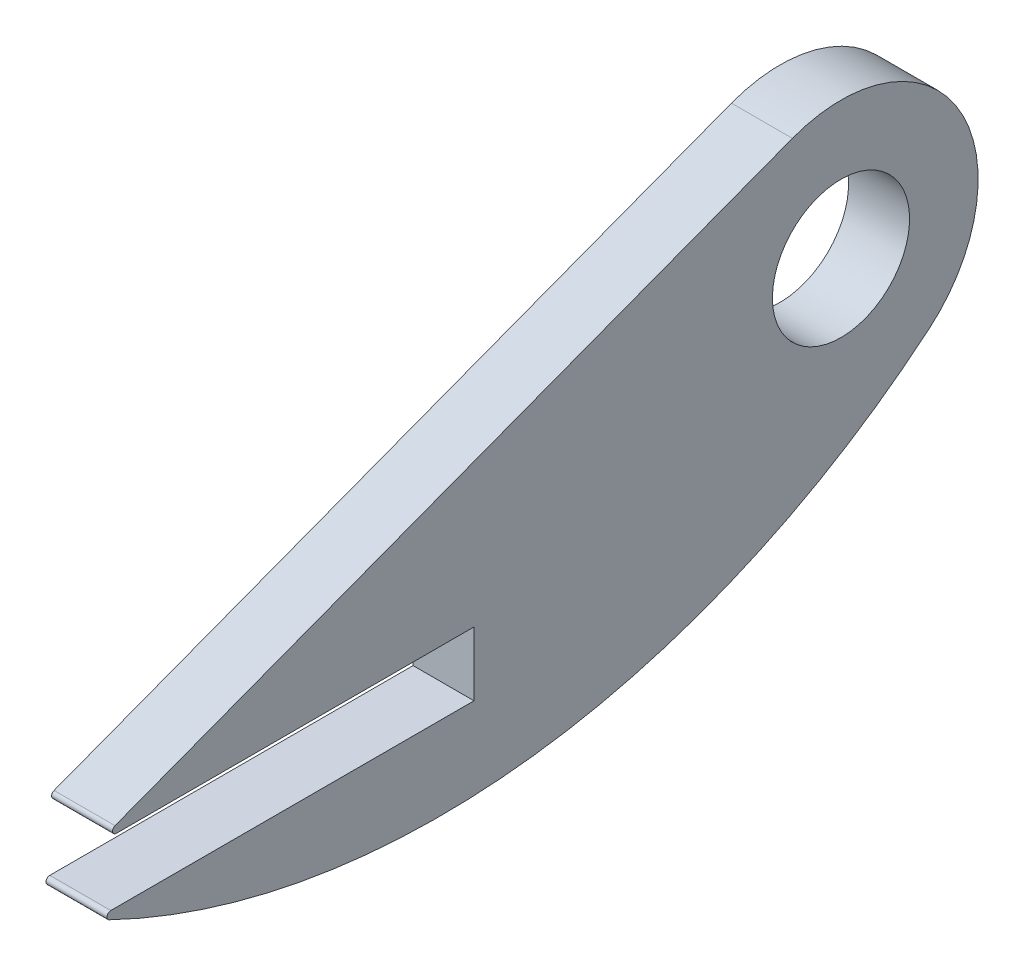
ISO-10303-21;
HEADER;
FILE_DESCRIPTION(('STEP AP214'),'2;1');
FILE_NAME('part.step','',(''),(''),'','','');
FILE_SCHEMA(('AUTOMOTIVE_DESIGN { 1 0 10303 214 1 1 1 1 }'));
ENDSEC;
DATA;
#1=APPLICATION_CONTEXT('core data for automotive mechanical design processes');
#2=APPLICATION_PROTOCOL_DEFINITION('international standard','automotive_design',2000,#1);
#3=PRODUCT_CONTEXT('',#1,'mechanical');
#4=PRODUCT('Part','Part','',(#3));
#5=PRODUCT_RELATED_PRODUCT_CATEGORY('part','',(#4));
#6=PRODUCT_DEFINITION_FORMATION('','',#4);
#7=PRODUCT_DEFINITION_CONTEXT('part definition',#1,'design');
#8=PRODUCT_DEFINITION('design','',#6,#7);
#9=PRODUCT_DEFINITION_SHAPE('','',#8);
#10=(LENGTH_UNIT() NAMED_UNIT(*) SI_UNIT(.MILLI.,.METRE.));
#11=(NAMED_UNIT(*) PLANE_ANGLE_UNIT() SI_UNIT($,.RADIAN.));
#12=(NAMED_UNIT(*) SI_UNIT($,.STERADIAN.) SOLID_ANGLE_UNIT());
#13=UNCERTAINTY_MEASURE_WITH_UNIT(LENGTH_MEASURE(1.E-05),#10,'distance_accuracy_value','');
#14=(GEOMETRIC_REPRESENTATION_CONTEXT(3) GLOBAL_UNCERTAINTY_ASSIGNED_CONTEXT((#13)) GLOBAL_UNIT_ASSIGNED_CONTEXT((#10,
#11,#12)) REPRESENTATION_CONTEXT('',''));
#15=CARTESIAN_POINT('',(0.,0.,0.));
#16=DIRECTION('',(0.,0.,1.));
#17=DIRECTION('',(1.,0.,0.));
#18=AXIS2_PLACEMENT_3D('',#15,#16,#17);
#19=CARTESIAN_POINT('',(-205.918926936471,13.,-160.18));
#20=DIRECTION('',(-1.,0.,0.));
#21=DIRECTION('',(0.,0.,1.));
#22=AXIS2_PLACEMENT_3D('',#19,#20,#21);
#23=CYLINDRICAL_SURFACE('',#22,4.49999999999999);
#24=CARTESIAN_POINT('',(-205.918926936471,13.,-160.18));
#25=DIRECTION('',(1.,0.,0.));
#26=DIRECTION('',(0.,0.,1.));
#27=AXIS2_PLACEMENT_3D('',#24,#25,#26);
#28=CIRCLE('',#27,4.49999999999999);
#29=CARTESIAN_POINT('',(-205.918926936471,13.,-155.68));
#30=VERTEX_POINT('',#29);
#31=EDGE_CURVE('E133',#30,#30,#28,.T.);
#32=ORIENTED_EDGE('',*,*,#31,.T.);
#33=EDGE_LOOP('',(#32));
#34=FACE_BOUND('',#33,.T.);
#35=CARTESIAN_POINT('',(-209.918926936471,13.,-160.18));
#36=DIRECTION('',(1.,0.,0.));
#37=DIRECTION('',(0.,0.,1.));
#38=AXIS2_PLACEMENT_3D('',#35,#36,#37);
#39=CIRCLE('',#38,4.49999999999999);
#40=CARTESIAN_POINT('',(-209.918926936471,13.,-155.68));
#41=VERTEX_POINT('',#40);
#42=EDGE_CURVE('E138',#41,#41,#39,.T.);
#43=ORIENTED_EDGE('',*,*,#42,.F.);
#44=EDGE_LOOP('',(#43));
#45=FACE_BOUND('',#44,.T.);
#46=ADVANCED_FACE('F33',(#34,#45),#23,.F.);
#47=CARTESIAN_POINT('',(-205.918926936471,13.,-160.18));
#48=DIRECTION('',(-1.,0.,0.));
#49=DIRECTION('',(0.,0.,1.));
#50=AXIS2_PLACEMENT_3D('',#47,#48,#49);
#51=CYLINDRICAL_SURFACE('',#50,9.00000000000001);
#52=CARTESIAN_POINT('',(-209.918926936471,13.,-160.18));
#53=DIRECTION('',(1.,0.,0.));
#54=DIRECTION('',(0.,0.,-1.));
#55=AXIS2_PLACEMENT_3D('',#52,#53,#54);
#56=CIRCLE('',#55,9.00000000000001);
#57=CARTESIAN_POINT('',(-209.918926936471,6.09499106935062,-165.952421646731));
#58=VERTEX_POINT('',#57);
#59=CARTESIAN_POINT('',(-209.918926936471,21.4167235674563,-156.992718338611));
#60=VERTEX_POINT('',#59);
#61=EDGE_CURVE('E149',#58,#60,#56,.T.);
#62=ORIENTED_EDGE('',*,*,#61,.T.);
#63=DIRECTION('',(-1.,0.,0.));
#64=VECTOR('',#63,1.);
#65=CARTESIAN_POINT('',(-205.918926936471,21.4167235674563,-156.992718338611));
#66=LINE('',#65,#64);
#67=CARTESIAN_POINT('',(-205.918926936471,21.4167235674563,-156.992718338611));
#68=VERTEX_POINT('',#67);
#69=EDGE_CURVE('E137',#68,#60,#66,.T.);
#70=ORIENTED_EDGE('',*,*,#69,.F.);
#71=CARTESIAN_POINT('',(-205.918926936471,13.,-160.18));
#72=DIRECTION('',(1.,0.,0.));
#73=DIRECTION('',(0.,0.,-1.));
#74=AXIS2_PLACEMENT_3D('',#71,#72,#73);
#75=CIRCLE('',#74,9.00000000000001);
#76=CARTESIAN_POINT('',(-205.918926936471,6.09499106935062,-165.952421646731));
#77=VERTEX_POINT('',#76);
#78=EDGE_CURVE('E142',#77,#68,#75,.T.);
#79=ORIENTED_EDGE('',*,*,#78,.F.);
#80=DIRECTION('',(-1.,0.,0.));
#81=VECTOR('',#80,1.);
#82=CARTESIAN_POINT('',(-205.918926936471,6.09499106935062,-165.952421646731));
#83=LINE('',#82,#81);
#84=EDGE_CURVE('E151',#77,#58,#83,.T.);
#85=ORIENTED_EDGE('',*,*,#84,.T.);
#86=EDGE_LOOP('',(#62,#70,#79,#85));
#87=FACE_BOUND('',#86,.T.);
#88=ADVANCED_FACE('F180',(#87),#51,.T.);
#89=CARTESIAN_POINT('',(-205.918926936471,44.4561517951805,-133.883412498224));
#90=DIRECTION('',(-1.,0.,0.));
#91=DIRECTION('',(0.,0.,1.));
#92=AXIS2_PLACEMENT_3D('',#89,#90,#91);
#93=CYLINDRICAL_SURFACE('',#92,50.);
#94=CARTESIAN_POINT('',(-205.918926936471,44.4561517951805,-133.883412498224));
#95=DIRECTION('',(1.,0.,0.));
#96=DIRECTION('',(0.,0.,-1.));
#97=AXIS2_PLACEMENT_3D('',#94,#95,#96);
#98=CIRCLE('',#97,50.);
#99=CARTESIAN_POINT('',(-205.918926936471,-0.57515654168433,-112.153680114455));
#100=VERTEX_POINT('',#99);
#101=EDGE_CURVE('E143',#100,#77,#98,.T.);
#102=ORIENTED_EDGE('',*,*,#101,.F.);
#103=DIRECTION('',(-1.,0.,0.));
#104=VECTOR('',#103,1.);
#105=CARTESIAN_POINT('',(-205.918926936471,-0.575156541684323,-112.153680114455));
#106=LINE('',#105,#104);
#107=CARTESIAN_POINT('',(-209.918926936471,-0.57515654168433,-112.153680114455));
#108=VERTEX_POINT('',#107);
#109=EDGE_CURVE('E163',#100,#108,#106,.T.);
#110=ORIENTED_EDGE('',*,*,#109,.T.);
#111=CARTESIAN_POINT('',(-209.918926936471,44.4561517951805,-133.883412498224));
#112=DIRECTION('',(1.,0.,0.));
#113=DIRECTION('',(0.,0.,-1.));
#114=AXIS2_PLACEMENT_3D('',#111,#112,#113);
#115=CIRCLE('',#114,50.);
#116=EDGE_CURVE('E141',#108,#58,#115,.T.);
#117=ORIENTED_EDGE('',*,*,#116,.T.);
#118=ORIENTED_EDGE('',*,*,#84,.F.);
#119=EDGE_LOOP('',(#102,#110,#117,#118));
#120=FACE_BOUND('',#119,.T.);
#121=ADVANCED_FACE('F183',(#120),#93,.T.);
#122=CARTESIAN_POINT('',(-205.918926936471,21.4167235674563,-156.992718338611));
#123=DIRECTION('',(0.,-0.935191507495142,-0.35414240682099));
#124=DIRECTION('',(0.,0.35414240682099,-0.935191507495142));
#125=AXIS2_PLACEMENT_3D('',#122,#123,#124);
#126=PLANE('',#125);
#127=DIRECTION('',(0.,-0.354142406820989,0.935191507495142));
#128=VECTOR('',#127,1.);
#129=CARTESIAN_POINT('',(-209.918926936471,21.4167235674563,-156.992718338611));
#130=LINE('',#129,#128);
#131=CARTESIAN_POINT('',(-209.918926936471,4.5837978768738,-112.541647670628));
#132=VERTEX_POINT('',#131);
#133=EDGE_CURVE('E152',#60,#132,#130,.T.);
#134=ORIENTED_EDGE('',*,*,#133,.T.);
#135=DIRECTION('',(-1.,0.,0.));
#136=VECTOR('',#135,1.);
#137=CARTESIAN_POINT('',(-205.918926936471,4.58379787687379,-112.541647670628));
#138=LINE('',#137,#136);
#139=CARTESIAN_POINT('',(-205.918926936471,4.5837978768738,-112.541647670628));
#140=VERTEX_POINT('',#139);
#141=EDGE_CURVE('E11',#132,#140,#138,.F.);
#142=ORIENTED_EDGE('',*,*,#141,.T.);
#143=DIRECTION('',(0.,-0.354142406820989,0.935191507495142));
#144=VECTOR('',#143,1.);
#145=CARTESIAN_POINT('',(-205.918926936471,21.4167235674563,-156.992718338611));
#146=LINE('',#145,#144);
#147=EDGE_CURVE('E132',#68,#140,#146,.T.);
#148=ORIENTED_EDGE('',*,*,#147,.F.);
#149=ORIENTED_EDGE('',*,*,#69,.T.);
#150=EDGE_LOOP('',(#134,#142,#148,#149));
#151=FACE_BOUND('',#150,.T.);
#152=ADVANCED_FACE('F176',(#151),#126,.F.);
#153=CARTESIAN_POINT('',(-209.918926936471,44.4561517951805,-133.883412498224));
#154=DIRECTION('',(1.,0.,0.));
#155=DIRECTION('',(0.,0.,-1.));
#156=AXIS2_PLACEMENT_3D('',#153,#154,#155);
#157=PLANE('',#156);
#158=ORIENTED_EDGE('',*,*,#42,.T.);
#159=EDGE_LOOP('',(#158));
#160=FACE_BOUND('',#159,.T.);
#161=ORIENTED_EDGE('',*,*,#116,.F.);
#162=CARTESIAN_POINT('',(-209.918926936471,-0.350000000000003,-112.262328776374));
#163=DIRECTION('',(1.,0.,0.));
#164=DIRECTION('',(0.,0.,-1.));
#165=AXIS2_PLACEMENT_3D('',#162,#163,#164);
#166=CIRCLE('',#165,0.25);
#167=CARTESIAN_POINT('',(-209.918926936471,-0.100000000000003,-112.262328776374));
#168=VERTEX_POINT('',#167);
#169=EDGE_CURVE('E122',#108,#168,#166,.F.);
#170=ORIENTED_EDGE('',*,*,#169,.T.);
#171=DIRECTION('',(0.,0.,1.));
#172=VECTOR('',#171,1.);
#173=CARTESIAN_POINT('',(-209.918926936471,-0.100000000000003,-133.883412498224));
#174=LINE('',#173,#172);
#175=CARTESIAN_POINT('',(-209.918926936471,-0.100000000000003,-136.1));
#176=VERTEX_POINT('',#175);
#177=EDGE_CURVE('E115',#176,#168,#174,.T.);
#178=ORIENTED_EDGE('',*,*,#177,.F.);
#179=DIRECTION('',(0.,-1.,0.));
#180=VECTOR('',#179,1.);
#181=CARTESIAN_POINT('',(-209.918926936471,44.4561517951805,-136.1));
#182=LINE('',#181,#180);
#183=CARTESIAN_POINT('',(-209.918926936471,4.10000000000001,-136.1));
#184=VERTEX_POINT('',#183);
#185=EDGE_CURVE('E99',#184,#176,#182,.T.);
#186=ORIENTED_EDGE('',*,*,#185,.F.);
#187=DIRECTION('',(0.,0.,-1.));
#188=VECTOR('',#187,1.);
#189=CARTESIAN_POINT('',(-209.918926936471,4.10000000000001,-133.883412498224));
#190=LINE('',#189,#188);
#191=CARTESIAN_POINT('',(-209.918926936471,4.10000000000001,-112.630183272333));
#192=VERTEX_POINT('',#191);
#193=EDGE_CURVE('E128',#192,#184,#190,.T.);
#194=ORIENTED_EDGE('',*,*,#193,.F.);
#195=CARTESIAN_POINT('',(-209.918926936471,4.35000000000001,-112.630183272333));
#196=DIRECTION('',(1.,0.,0.));
#197=DIRECTION('',(0.,0.,-1.));
#198=AXIS2_PLACEMENT_3D('',#195,#196,#197);
#199=CIRCLE('',#198,0.25);
#200=EDGE_CURVE('E48',#192,#132,#199,.F.);
#201=ORIENTED_EDGE('',*,*,#200,.T.);
#202=ORIENTED_EDGE('',*,*,#133,.F.);
#203=ORIENTED_EDGE('',*,*,#61,.F.);
#204=EDGE_LOOP('',(#161,#170,#178,#186,#194,#201,#202,#203));
#205=FACE_BOUND('',#204,.T.);
#206=ADVANCED_FACE('F120',(#160,#205),#157,.F.);
#207=CARTESIAN_POINT('',(-205.918926936471,44.4561517951805,-133.883412498224));
#208=DIRECTION('',(1.,0.,0.));
#209=DIRECTION('',(0.,0.,-1.));
#210=AXIS2_PLACEMENT_3D('',#207,#208,#209);
#211=PLANE('',#210);
#212=ORIENTED_EDGE('',*,*,#31,.F.);
#213=EDGE_LOOP('',(#212));
#214=FACE_BOUND('',#213,.T.);
#215=DIRECTION('',(0.,0.,1.));
#216=VECTOR('',#215,1.);
#217=CARTESIAN_POINT('',(-205.918926936471,-0.100000000000003,-133.883412498224));
#218=LINE('',#217,#216);
#219=CARTESIAN_POINT('',(-205.918926936471,-0.100000000000003,-136.1));
#220=VERTEX_POINT('',#219);
#221=CARTESIAN_POINT('',(-205.918926936471,-0.100000000000003,-112.262328776374));
#222=VERTEX_POINT('',#221);
#223=EDGE_CURVE('E109',#220,#222,#218,.T.);
#224=ORIENTED_EDGE('',*,*,#223,.T.);
#225=CARTESIAN_POINT('',(-205.918926936471,-0.350000000000003,-112.262328776374));
#226=DIRECTION('',(1.,0.,0.));
#227=DIRECTION('',(0.,0.,-1.));
#228=AXIS2_PLACEMENT_3D('',#225,#226,#227);
#229=CIRCLE('',#228,0.25);
#230=EDGE_CURVE('E161',#222,#100,#229,.T.);
#231=ORIENTED_EDGE('',*,*,#230,.T.);
#232=ORIENTED_EDGE('',*,*,#101,.T.);
#233=ORIENTED_EDGE('',*,*,#78,.T.);
#234=ORIENTED_EDGE('',*,*,#147,.T.);
#235=CARTESIAN_POINT('',(-205.918926936471,4.35000000000001,-112.630183272333));
#236=DIRECTION('',(1.,0.,0.));
#237=DIRECTION('',(0.,0.,-1.));
#238=AXIS2_PLACEMENT_3D('',#235,#236,#237);
#239=CIRCLE('',#238,0.25);
#240=CARTESIAN_POINT('',(-205.918926936471,4.10000000000001,-112.630183272333));
#241=VERTEX_POINT('',#240);
#242=EDGE_CURVE('E159',#140,#241,#239,.T.);
#243=ORIENTED_EDGE('',*,*,#242,.T.);
#244=DIRECTION('',(0.,0.,-1.));
#245=VECTOR('',#244,1.);
#246=CARTESIAN_POINT('',(-205.918926936471,4.10000000000001,-133.883412498224));
#247=LINE('',#246,#245);
#248=CARTESIAN_POINT('',(-205.918926936471,4.10000000000001,-136.1));
#249=VERTEX_POINT('',#248);
#250=EDGE_CURVE('E130',#241,#249,#247,.T.);
#251=ORIENTED_EDGE('',*,*,#250,.T.);
#252=DIRECTION('',(0.,-1.,0.));
#253=VECTOR('',#252,1.);
#254=CARTESIAN_POINT('',(-205.918926936471,44.4561517951805,-136.1));
#255=LINE('',#254,#253);
#256=EDGE_CURVE('E108',#249,#220,#255,.T.);
#257=ORIENTED_EDGE('',*,*,#256,.T.);
#258=EDGE_LOOP('',(#224,#231,#232,#233,#234,#243,#251,#257));
#259=FACE_BOUND('',#258,.T.);
#260=ADVANCED_FACE('F171',(#214,#259),#211,.T.);
#261=CARTESIAN_POINT('',(-385.855743978742,-0.100000000000003,-136.));
#262=DIRECTION('',(0.,1.,0.));
#263=DIRECTION('',(0.,0.,1.));
#264=AXIS2_PLACEMENT_3D('',#261,#262,#263);
#265=PLANE('',#264);
#266=ORIENTED_EDGE('',*,*,#177,.T.);
#267=DIRECTION('',(1.,0.,0.));
#268=VECTOR('',#267,1.);
#269=CARTESIAN_POINT('',(-205.918926936471,-0.100000000000003,-112.262328776374));
#270=LINE('',#269,#268);
#271=EDGE_CURVE('E136',#168,#222,#270,.T.);
#272=ORIENTED_EDGE('',*,*,#271,.T.);
#273=ORIENTED_EDGE('',*,*,#223,.F.);
#274=DIRECTION('',(1.,0.,0.));
#275=VECTOR('',#274,1.);
#276=CARTESIAN_POINT('',(-385.855743978742,-0.100000000000003,-136.1));
#277=LINE('',#276,#275);
#278=EDGE_CURVE('E103',#176,#220,#277,.T.);
#279=ORIENTED_EDGE('',*,*,#278,.F.);
#280=EDGE_LOOP('',(#266,#272,#273,#279));
#281=FACE_BOUND('',#280,.T.);
#282=ADVANCED_FACE('F113',(#281),#265,.T.);
#283=CARTESIAN_POINT('',(-385.855743978742,4.10000000000001,-136.));
#284=DIRECTION('',(0.,-1.,0.));
#285=DIRECTION('',(0.,0.,-1.));
#286=AXIS2_PLACEMENT_3D('',#283,#284,#285);
#287=PLANE('',#286);
#288=ORIENTED_EDGE('',*,*,#250,.F.);
#289=DIRECTION('',(-1.,0.,0.));
#290=VECTOR('',#289,1.);
#291=CARTESIAN_POINT('',(-209.918926936471,4.10000000000001,-112.630183272333));
#292=LINE('',#291,#290);
#293=EDGE_CURVE('E41',#241,#192,#292,.T.);
#294=ORIENTED_EDGE('',*,*,#293,.T.);
#295=ORIENTED_EDGE('',*,*,#193,.T.);
#296=DIRECTION('',(1.,0.,0.));
#297=VECTOR('',#296,1.);
#298=CARTESIAN_POINT('',(-385.855743978742,4.10000000000001,-136.1));
#299=LINE('',#298,#297);
#300=EDGE_CURVE('E106',#184,#249,#299,.T.);
#301=ORIENTED_EDGE('',*,*,#300,.T.);
#302=EDGE_LOOP('',(#288,#294,#295,#301));
#303=FACE_BOUND('',#302,.T.);
#304=ADVANCED_FACE('F168',(#303),#287,.T.);
#305=CARTESIAN_POINT('',(-385.855743978742,4.,-136.1));
#306=DIRECTION('',(0.,0.,1.));
#307=DIRECTION('',(1.,0.,0.));
#308=AXIS2_PLACEMENT_3D('',#305,#306,#307);
#309=PLANE('',#308);
#310=ORIENTED_EDGE('',*,*,#300,.F.);
#311=ORIENTED_EDGE('',*,*,#185,.T.);
#312=ORIENTED_EDGE('',*,*,#278,.T.);
#313=ORIENTED_EDGE('',*,*,#256,.F.);
#314=EDGE_LOOP('',(#310,#311,#312,#313));
#315=FACE_BOUND('',#314,.T.);
#316=ADVANCED_FACE('F101',(#315),#309,.T.);
#317=CARTESIAN_POINT('',(-205.918926936471,-0.350000000000003,-112.262328776374));
#318=DIRECTION('',(-1.,0.,0.));
#319=DIRECTION('',(0.,0.,1.));
#320=AXIS2_PLACEMENT_3D('',#317,#318,#319);
#321=CYLINDRICAL_SURFACE('',#320,0.25);
#322=ORIENTED_EDGE('',*,*,#169,.F.);
#323=ORIENTED_EDGE('',*,*,#109,.F.);
#324=ORIENTED_EDGE('',*,*,#230,.F.);
#325=ORIENTED_EDGE('',*,*,#271,.F.);
#326=EDGE_LOOP('',(#322,#323,#324,#325));
#327=FACE_BOUND('',#326,.T.);
#328=ADVANCED_FACE('F186',(#327),#321,.T.);
#329=CARTESIAN_POINT('',(-385.855743978742,4.35000000000001,-112.630183272333));
#330=DIRECTION('',(1.,0.,0.));
#331=DIRECTION('',(0.,0.,-1.));
#332=AXIS2_PLACEMENT_3D('',#329,#330,#331);
#333=CYLINDRICAL_SURFACE('',#332,0.25);
#334=ORIENTED_EDGE('',*,*,#242,.F.);
#335=ORIENTED_EDGE('',*,*,#141,.F.);
#336=ORIENTED_EDGE('',*,*,#200,.F.);
#337=ORIENTED_EDGE('',*,*,#293,.F.);
#338=EDGE_LOOP('',(#334,#335,#336,#337));
#339=FACE_BOUND('',#338,.T.);
#340=ADVANCED_FACE('F35',(#339),#333,.T.);
#341=CLOSED_SHELL('',(#46,#88,#121,#152,#206,#260,#282,#304,#316,#328,#340));
#342=MANIFOLD_SOLID_BREP('B2',#341);
#343=ADVANCED_BREP_SHAPE_REPRESENTATION('',(#18,#342),#14);
#344=SHAPE_DEFINITION_REPRESENTATION(#9,#343);
ENDSEC;
END-ISO-10303-21;
